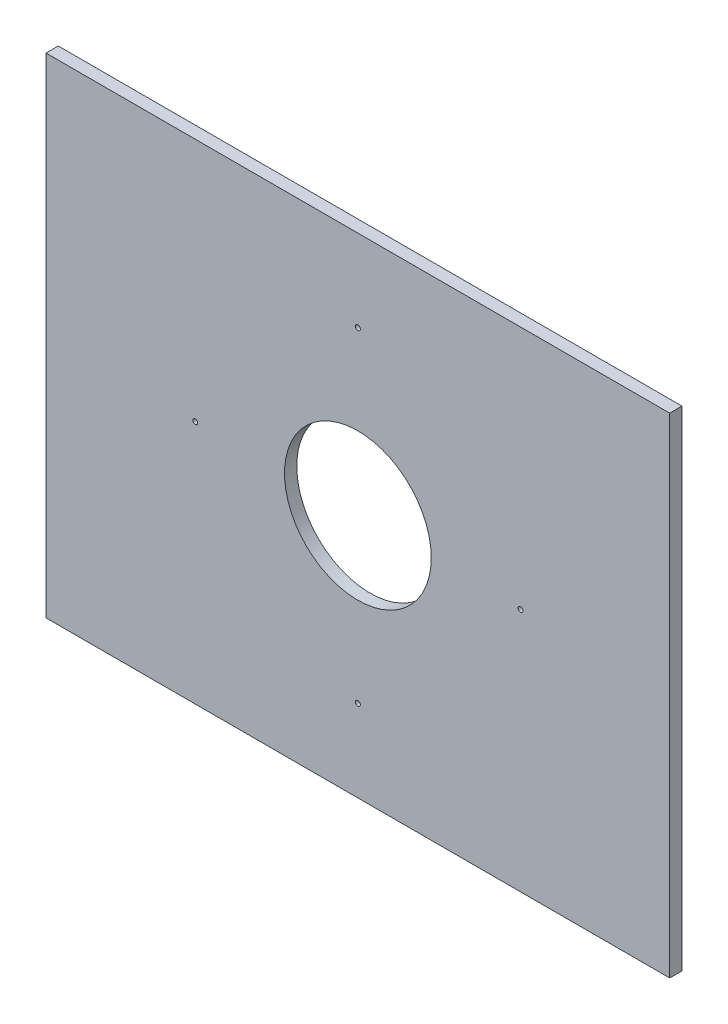
ISO-10303-21;
HEADER;
FILE_DESCRIPTION(('STEP AP214'),'2;1');
FILE_NAME('part.step','',(''),(''),'','','');
FILE_SCHEMA(('AUTOMOTIVE_DESIGN { 1 0 10303 214 1 1 1 1 }'));
ENDSEC;
DATA;
#1=APPLICATION_CONTEXT('core data for automotive mechanical design processes');
#2=APPLICATION_PROTOCOL_DEFINITION('international standard','automotive_design',2000,#1);
#3=PRODUCT_CONTEXT('',#1,'mechanical');
#4=PRODUCT('Part','Part','',(#3));
#5=PRODUCT_RELATED_PRODUCT_CATEGORY('part','',(#4));
#6=PRODUCT_DEFINITION_FORMATION('','',#4);
#7=PRODUCT_DEFINITION_CONTEXT('part definition',#1,'design');
#8=PRODUCT_DEFINITION('design','',#6,#7);
#9=PRODUCT_DEFINITION_SHAPE('','',#8);
#10=(LENGTH_UNIT() NAMED_UNIT(*) SI_UNIT(.MILLI.,.METRE.));
#11=(NAMED_UNIT(*) PLANE_ANGLE_UNIT() SI_UNIT($,.RADIAN.));
#12=(NAMED_UNIT(*) SI_UNIT($,.STERADIAN.) SOLID_ANGLE_UNIT());
#13=UNCERTAINTY_MEASURE_WITH_UNIT(LENGTH_MEASURE(1.E-05),#10,'distance_accuracy_value','');
#14=(GEOMETRIC_REPRESENTATION_CONTEXT(3) GLOBAL_UNCERTAINTY_ASSIGNED_CONTEXT((#13)) GLOBAL_UNIT_ASSIGNED_CONTEXT((#10,
#11,#12)) REPRESENTATION_CONTEXT('',''));
#15=CARTESIAN_POINT('',(0.,0.,0.));
#16=DIRECTION('',(0.,0.,1.));
#17=DIRECTION('',(1.,0.,0.));
#18=AXIS2_PLACEMENT_3D('',#15,#16,#17);
#19=CARTESIAN_POINT('',(0.,0.,5.));
#20=DIRECTION('',(0.,0.,-1.));
#21=DIRECTION('',(-1.,0.,0.));
#22=AXIS2_PLACEMENT_3D('',#19,#20,#21);
#23=PLANE('',#22);
#24=CARTESIAN_POINT('',(194.,99.9999999999995,5.));
#25=DIRECTION('',(0.,0.,-1.));
#26=DIRECTION('',(-1.,0.,0.));
#27=AXIS2_PLACEMENT_3D('',#24,#25,#26);
#28=CIRCLE('',#27,0.999999999999998);
#29=CARTESIAN_POINT('',(193.,99.9999999999995,5.));
#30=VERTEX_POINT('',#29);
#31=EDGE_CURVE('E129',#30,#30,#28,.F.);
#32=ORIENTED_EDGE('',*,*,#31,.F.);
#33=EDGE_LOOP('',(#32));
#34=FACE_BOUND('',#33,.T.);
#35=CARTESIAN_POINT('',(61.,100.,5.));
#36=DIRECTION('',(0.,0.,-1.));
#37=DIRECTION('',(-1.,0.,0.));
#38=AXIS2_PLACEMENT_3D('',#35,#36,#37);
#39=CIRCLE('',#38,0.999999999999998);
#40=CARTESIAN_POINT('',(60.,100.,5.));
#41=VERTEX_POINT('',#40);
#42=EDGE_CURVE('E115',#41,#41,#39,.F.);
#43=ORIENTED_EDGE('',*,*,#42,.F.);
#44=EDGE_LOOP('',(#43));
#45=FACE_BOUND('',#44,.T.);
#46=DIRECTION('',(0.,-1.,0.));
#47=VECTOR('',#46,1.);
#48=CARTESIAN_POINT('',(0.,0.,5.));
#49=LINE('',#48,#47);
#50=CARTESIAN_POINT('',(0.,200.,5.));
#51=VERTEX_POINT('',#50);
#52=CARTESIAN_POINT('',(0.,0.,5.));
#53=VERTEX_POINT('',#52);
#54=EDGE_CURVE('E85',#51,#53,#49,.T.);
#55=ORIENTED_EDGE('',*,*,#54,.T.);
#56=DIRECTION('',(1.,0.,0.));
#57=VECTOR('',#56,1.);
#58=CARTESIAN_POINT('',(0.,0.,5.));
#59=LINE('',#58,#57);
#60=CARTESIAN_POINT('',(255.,0.,5.));
#61=VERTEX_POINT('',#60);
#62=EDGE_CURVE('E80',#53,#61,#59,.T.);
#63=ORIENTED_EDGE('',*,*,#62,.T.);
#64=DIRECTION('',(0.,1.,0.));
#65=VECTOR('',#64,1.);
#66=CARTESIAN_POINT('',(255.,0.,5.));
#67=LINE('',#66,#65);
#68=CARTESIAN_POINT('',(255.,200.,5.));
#69=VERTEX_POINT('',#68);
#70=EDGE_CURVE('E83',#61,#69,#67,.T.);
#71=ORIENTED_EDGE('',*,*,#70,.T.);
#72=DIRECTION('',(-1.,0.,0.));
#73=VECTOR('',#72,1.);
#74=CARTESIAN_POINT('',(0.,200.,5.));
#75=LINE('',#74,#73);
#76=EDGE_CURVE('E50',#69,#51,#75,.T.);
#77=ORIENTED_EDGE('',*,*,#76,.T.);
#78=EDGE_LOOP('',(#55,#63,#71,#77));
#79=FACE_BOUND('',#78,.T.);
#80=CARTESIAN_POINT('',(127.5,100.,5.));
#81=DIRECTION('',(0.,0.,1.));
#82=DIRECTION('',(1.,0.,0.));
#83=AXIS2_PLACEMENT_3D('',#80,#81,#82);
#84=CIRCLE('',#83,30.);
#85=CARTESIAN_POINT('',(157.5,100.,5.));
#86=VERTEX_POINT('',#85);
#87=EDGE_CURVE('E100',#86,#86,#84,.T.);
#88=ORIENTED_EDGE('',*,*,#87,.F.);
#89=EDGE_LOOP('',(#88));
#90=FACE_BOUND('',#89,.T.);
#91=CARTESIAN_POINT('',(127.5,166.5,5.));
#92=DIRECTION('',(0.,0.,-1.));
#93=DIRECTION('',(-1.,0.,0.));
#94=AXIS2_PLACEMENT_3D('',#91,#92,#93);
#95=CIRCLE('',#94,0.999999999999998);
#96=CARTESIAN_POINT('',(126.5,166.5,5.));
#97=VERTEX_POINT('',#96);
#98=EDGE_CURVE('E123',#97,#97,#95,.F.);
#99=ORIENTED_EDGE('',*,*,#98,.F.);
#100=EDGE_LOOP('',(#99));
#101=FACE_BOUND('',#100,.T.);
#102=CARTESIAN_POINT('',(127.499999999999,33.5,5.));
#103=DIRECTION('',(0.,0.,-1.));
#104=DIRECTION('',(-1.,0.,0.));
#105=AXIS2_PLACEMENT_3D('',#102,#103,#104);
#106=CIRCLE('',#105,0.99999999999999);
#107=CARTESIAN_POINT('',(126.499999999999,33.5,5.));
#108=VERTEX_POINT('',#107);
#109=EDGE_CURVE('E135',#108,#108,#106,.F.);
#110=ORIENTED_EDGE('',*,*,#109,.F.);
#111=EDGE_LOOP('',(#110));
#112=FACE_BOUND('',#111,.T.);
#113=ADVANCED_FACE('F33',(#34,#45,#79,#90,#101,#112),#23,.F.);
#114=CARTESIAN_POINT('',(0.,0.,0.));
#115=DIRECTION('',(0.,0.,-1.));
#116=DIRECTION('',(-1.,0.,0.));
#117=AXIS2_PLACEMENT_3D('',#114,#115,#116);
#118=PLANE('',#117);
#119=CARTESIAN_POINT('',(194.,99.9999999999995,0.));
#120=DIRECTION('',(0.,0.,1.));
#121=DIRECTION('',(1.,0.,0.));
#122=AXIS2_PLACEMENT_3D('',#119,#120,#121);
#123=CIRCLE('',#122,0.999999999999998);
#124=CARTESIAN_POINT('',(195.,99.9999999999995,0.));
#125=VERTEX_POINT('',#124);
#126=EDGE_CURVE('E132',#125,#125,#123,.T.);
#127=ORIENTED_EDGE('',*,*,#126,.T.);
#128=EDGE_LOOP('',(#127));
#129=FACE_BOUND('',#128,.T.);
#130=CARTESIAN_POINT('',(61.,100.,0.));
#131=DIRECTION('',(0.,0.,1.));
#132=DIRECTION('',(1.,0.,0.));
#133=AXIS2_PLACEMENT_3D('',#130,#131,#132);
#134=CIRCLE('',#133,0.999999999999998);
#135=CARTESIAN_POINT('',(62.,100.,0.));
#136=VERTEX_POINT('',#135);
#137=EDGE_CURVE('E120',#136,#136,#134,.T.);
#138=ORIENTED_EDGE('',*,*,#137,.T.);
#139=EDGE_LOOP('',(#138));
#140=FACE_BOUND('',#139,.T.);
#141=DIRECTION('',(0.,-1.,0.));
#142=VECTOR('',#141,1.);
#143=CARTESIAN_POINT('',(0.,0.,0.));
#144=LINE('',#143,#142);
#145=CARTESIAN_POINT('',(0.,200.,0.));
#146=VERTEX_POINT('',#145);
#147=CARTESIAN_POINT('',(0.,0.,0.));
#148=VERTEX_POINT('',#147);
#149=EDGE_CURVE('E97',#146,#148,#144,.T.);
#150=ORIENTED_EDGE('',*,*,#149,.F.);
#151=DIRECTION('',(-1.,0.,0.));
#152=VECTOR('',#151,1.);
#153=CARTESIAN_POINT('',(0.,200.,0.));
#154=LINE('',#153,#152);
#155=CARTESIAN_POINT('',(255.,200.,0.));
#156=VERTEX_POINT('',#155);
#157=EDGE_CURVE('E73',#156,#146,#154,.T.);
#158=ORIENTED_EDGE('',*,*,#157,.F.);
#159=DIRECTION('',(0.,1.,0.));
#160=VECTOR('',#159,1.);
#161=CARTESIAN_POINT('',(255.,0.,0.));
#162=LINE('',#161,#160);
#163=CARTESIAN_POINT('',(255.,0.,0.));
#164=VERTEX_POINT('',#163);
#165=EDGE_CURVE('E67',#164,#156,#162,.T.);
#166=ORIENTED_EDGE('',*,*,#165,.F.);
#167=DIRECTION('',(1.,0.,0.));
#168=VECTOR('',#167,1.);
#169=CARTESIAN_POINT('',(0.,0.,0.));
#170=LINE('',#169,#168);
#171=EDGE_CURVE('E89',#148,#164,#170,.T.);
#172=ORIENTED_EDGE('',*,*,#171,.F.);
#173=EDGE_LOOP('',(#150,#158,#166,#172));
#174=FACE_BOUND('',#173,.T.);
#175=CARTESIAN_POINT('',(127.5,100.,0.));
#176=DIRECTION('',(0.,0.,1.));
#177=DIRECTION('',(1.,0.,0.));
#178=AXIS2_PLACEMENT_3D('',#175,#176,#177);
#179=CIRCLE('',#178,30.);
#180=CARTESIAN_POINT('',(157.5,100.,0.));
#181=VERTEX_POINT('',#180);
#182=EDGE_CURVE('E112',#181,#181,#179,.T.);
#183=ORIENTED_EDGE('',*,*,#182,.T.);
#184=EDGE_LOOP('',(#183));
#185=FACE_BOUND('',#184,.T.);
#186=CARTESIAN_POINT('',(127.5,166.5,0.));
#187=DIRECTION('',(0.,0.,1.));
#188=DIRECTION('',(1.,0.,0.));
#189=AXIS2_PLACEMENT_3D('',#186,#187,#188);
#190=CIRCLE('',#189,0.999999999999998);
#191=CARTESIAN_POINT('',(128.5,166.5,0.));
#192=VERTEX_POINT('',#191);
#193=EDGE_CURVE('E126',#192,#192,#190,.T.);
#194=ORIENTED_EDGE('',*,*,#193,.T.);
#195=EDGE_LOOP('',(#194));
#196=FACE_BOUND('',#195,.T.);
#197=CARTESIAN_POINT('',(127.499999999999,33.5,0.));
#198=DIRECTION('',(0.,0.,1.));
#199=DIRECTION('',(1.,0.,0.));
#200=AXIS2_PLACEMENT_3D('',#197,#198,#199);
#201=CIRCLE('',#200,0.99999999999999);
#202=CARTESIAN_POINT('',(128.499999999999,33.5,0.));
#203=VERTEX_POINT('',#202);
#204=EDGE_CURVE('E138',#203,#203,#201,.T.);
#205=ORIENTED_EDGE('',*,*,#204,.T.);
#206=EDGE_LOOP('',(#205));
#207=FACE_BOUND('',#206,.T.);
#208=ADVANCED_FACE('F108',(#129,#140,#174,#185,#196,#207),#118,.T.);
#209=CARTESIAN_POINT('',(0.,0.,5.));
#210=DIRECTION('',(1.,0.,0.));
#211=DIRECTION('',(0.,0.,-1.));
#212=AXIS2_PLACEMENT_3D('',#209,#210,#211);
#213=PLANE('',#212);
#214=ORIENTED_EDGE('',*,*,#149,.T.);
#215=DIRECTION('',(0.,0.,-1.));
#216=VECTOR('',#215,1.);
#217=CARTESIAN_POINT('',(0.,0.,5.));
#218=LINE('',#217,#216);
#219=EDGE_CURVE('E11',#53,#148,#218,.T.);
#220=ORIENTED_EDGE('',*,*,#219,.F.);
#221=ORIENTED_EDGE('',*,*,#54,.F.);
#222=DIRECTION('',(0.,0.,-1.));
#223=VECTOR('',#222,1.);
#224=CARTESIAN_POINT('',(0.,200.,5.));
#225=LINE('',#224,#223);
#226=EDGE_CURVE('E93',#51,#146,#225,.T.);
#227=ORIENTED_EDGE('',*,*,#226,.T.);
#228=EDGE_LOOP('',(#214,#220,#221,#227));
#229=FACE_BOUND('',#228,.T.);
#230=ADVANCED_FACE('F35',(#229),#213,.F.);
#231=CARTESIAN_POINT('',(0.,0.,5.));
#232=DIRECTION('',(0.,1.,0.));
#233=DIRECTION('',(0.,0.,1.));
#234=AXIS2_PLACEMENT_3D('',#231,#232,#233);
#235=PLANE('',#234);
#236=ORIENTED_EDGE('',*,*,#171,.T.);
#237=DIRECTION('',(0.,0.,-1.));
#238=VECTOR('',#237,1.);
#239=CARTESIAN_POINT('',(255.,0.,5.));
#240=LINE('',#239,#238);
#241=EDGE_CURVE('E42',#61,#164,#240,.T.);
#242=ORIENTED_EDGE('',*,*,#241,.F.);
#243=ORIENTED_EDGE('',*,*,#62,.F.);
#244=ORIENTED_EDGE('',*,*,#219,.T.);
#245=EDGE_LOOP('',(#236,#242,#243,#244));
#246=FACE_BOUND('',#245,.T.);
#247=ADVANCED_FACE('F88',(#246),#235,.F.);
#248=CARTESIAN_POINT('',(255.,0.,5.));
#249=DIRECTION('',(-1.,0.,0.));
#250=DIRECTION('',(0.,0.,1.));
#251=AXIS2_PLACEMENT_3D('',#248,#249,#250);
#252=PLANE('',#251);
#253=ORIENTED_EDGE('',*,*,#165,.T.);
#254=DIRECTION('',(0.,0.,-1.));
#255=VECTOR('',#254,1.);
#256=CARTESIAN_POINT('',(255.,200.,5.));
#257=LINE('',#256,#255);
#258=EDGE_CURVE('E90',#69,#156,#257,.T.);
#259=ORIENTED_EDGE('',*,*,#258,.F.);
#260=ORIENTED_EDGE('',*,*,#70,.F.);
#261=ORIENTED_EDGE('',*,*,#241,.T.);
#262=EDGE_LOOP('',(#253,#259,#260,#261));
#263=FACE_BOUND('',#262,.T.);
#264=ADVANCED_FACE('F91',(#263),#252,.F.);
#265=CARTESIAN_POINT('',(0.,200.,5.));
#266=DIRECTION('',(0.,-1.,0.));
#267=DIRECTION('',(0.,0.,-1.));
#268=AXIS2_PLACEMENT_3D('',#265,#266,#267);
#269=PLANE('',#268);
#270=ORIENTED_EDGE('',*,*,#157,.T.);
#271=ORIENTED_EDGE('',*,*,#226,.F.);
#272=ORIENTED_EDGE('',*,*,#76,.F.);
#273=ORIENTED_EDGE('',*,*,#258,.T.);
#274=EDGE_LOOP('',(#270,#271,#272,#273));
#275=FACE_BOUND('',#274,.T.);
#276=ADVANCED_FACE('F105',(#275),#269,.F.);
#277=CARTESIAN_POINT('',(127.5,100.,5.));
#278=DIRECTION('',(0.,0.,-1.));
#279=DIRECTION('',(-1.,0.,0.));
#280=AXIS2_PLACEMENT_3D('',#277,#278,#279);
#281=CYLINDRICAL_SURFACE('',#280,30.);
#282=ORIENTED_EDGE('',*,*,#87,.T.);
#283=EDGE_LOOP('',(#282));
#284=FACE_BOUND('',#283,.T.);
#285=ORIENTED_EDGE('',*,*,#182,.F.);
#286=EDGE_LOOP('',(#285));
#287=FACE_BOUND('',#286,.T.);
#288=ADVANCED_FACE('F161',(#284,#287),#281,.F.);
#289=CARTESIAN_POINT('',(61.,100.,28.));
#290=DIRECTION('',(0.,0.,-1.));
#291=DIRECTION('',(-1.,0.,0.));
#292=AXIS2_PLACEMENT_3D('',#289,#290,#291);
#293=CYLINDRICAL_SURFACE('',#292,0.999999999999998);
#294=ORIENTED_EDGE('',*,*,#137,.F.);
#295=EDGE_LOOP('',(#294));
#296=FACE_BOUND('',#295,.T.);
#297=ORIENTED_EDGE('',*,*,#42,.T.);
#298=EDGE_LOOP('',(#297));
#299=FACE_BOUND('',#298,.T.);
#300=ADVANCED_FACE('F186',(#296,#299),#293,.F.);
#301=CARTESIAN_POINT('',(127.5,166.5,28.));
#302=DIRECTION('',(0.,0.,-1.));
#303=DIRECTION('',(-1.,0.,0.));
#304=AXIS2_PLACEMENT_3D('',#301,#302,#303);
#305=CYLINDRICAL_SURFACE('',#304,0.999999999999998);
#306=ORIENTED_EDGE('',*,*,#193,.F.);
#307=EDGE_LOOP('',(#306));
#308=FACE_BOUND('',#307,.T.);
#309=ORIENTED_EDGE('',*,*,#98,.T.);
#310=EDGE_LOOP('',(#309));
#311=FACE_BOUND('',#310,.T.);
#312=ADVANCED_FACE('F191',(#308,#311),#305,.F.);
#313=CARTESIAN_POINT('',(194.,99.9999999999995,28.));
#314=DIRECTION('',(0.,0.,-1.));
#315=DIRECTION('',(-1.,0.,0.));
#316=AXIS2_PLACEMENT_3D('',#313,#314,#315);
#317=CYLINDRICAL_SURFACE('',#316,0.999999999999998);
#318=ORIENTED_EDGE('',*,*,#126,.F.);
#319=EDGE_LOOP('',(#318));
#320=FACE_BOUND('',#319,.T.);
#321=ORIENTED_EDGE('',*,*,#31,.T.);
#322=EDGE_LOOP('',(#321));
#323=FACE_BOUND('',#322,.T.);
#324=ADVANCED_FACE('F146',(#320,#323),#317,.F.);
#325=CARTESIAN_POINT('',(127.499999999999,33.5,28.));
#326=DIRECTION('',(0.,0.,-1.));
#327=DIRECTION('',(-1.,0.,0.));
#328=AXIS2_PLACEMENT_3D('',#325,#326,#327);
#329=CYLINDRICAL_SURFACE('',#328,0.99999999999999);
#330=ORIENTED_EDGE('',*,*,#204,.F.);
#331=EDGE_LOOP('',(#330));
#332=FACE_BOUND('',#331,.T.);
#333=ORIENTED_EDGE('',*,*,#109,.T.);
#334=EDGE_LOOP('',(#333));
#335=FACE_BOUND('',#334,.T.);
#336=ADVANCED_FACE('F143',(#332,#335),#329,.F.);
#337=CLOSED_SHELL('',(#113,#208,#230,#247,#264,#276,#288,#300,#312,#324,#336));
#338=MANIFOLD_SOLID_BREP('B2',#337);
#339=ADVANCED_BREP_SHAPE_REPRESENTATION('',(#18,#338),#14);
#340=SHAPE_DEFINITION_REPRESENTATION(#9,#339);
ENDSEC;
END-ISO-10303-21;
